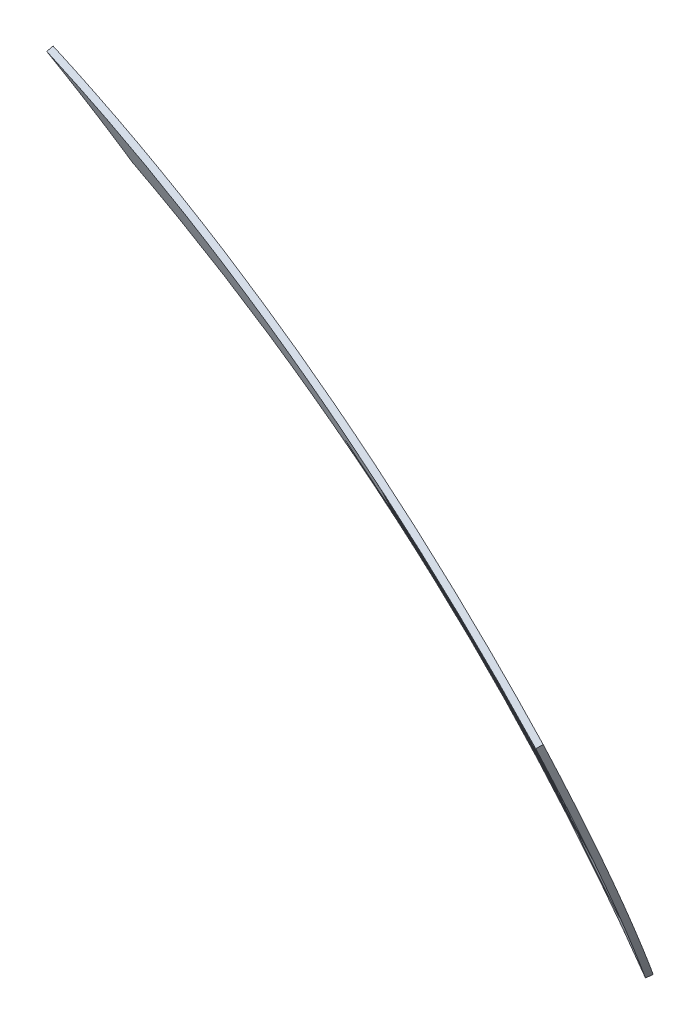
ISO-10303-21;
HEADER;
FILE_DESCRIPTION(('STEP AP214'),'2;1');
FILE_NAME('part.step','',(''),(''),'','','');
FILE_SCHEMA(('AUTOMOTIVE_DESIGN { 1 0 10303 214 1 1 1 1 }'));
ENDSEC;
DATA;
#1=APPLICATION_CONTEXT('core data for automotive mechanical design processes');
#2=APPLICATION_PROTOCOL_DEFINITION('international standard','automotive_design',2000,#1);
#3=PRODUCT_CONTEXT('',#1,'mechanical');
#4=PRODUCT('Part','Part','',(#3));
#5=PRODUCT_RELATED_PRODUCT_CATEGORY('part','',(#4));
#6=PRODUCT_DEFINITION_FORMATION('','',#4);
#7=PRODUCT_DEFINITION_CONTEXT('part definition',#1,'design');
#8=PRODUCT_DEFINITION('design','',#6,#7);
#9=PRODUCT_DEFINITION_SHAPE('','',#8);
#10=(LENGTH_UNIT() NAMED_UNIT(*) SI_UNIT(.MILLI.,.METRE.));
#11=(NAMED_UNIT(*) PLANE_ANGLE_UNIT() SI_UNIT($,.RADIAN.));
#12=(NAMED_UNIT(*) SI_UNIT($,.STERADIAN.) SOLID_ANGLE_UNIT());
#13=UNCERTAINTY_MEASURE_WITH_UNIT(LENGTH_MEASURE(1.E-05),#10,'distance_accuracy_value','');
#14=(GEOMETRIC_REPRESENTATION_CONTEXT(3) GLOBAL_UNCERTAINTY_ASSIGNED_CONTEXT((#13)) GLOBAL_UNIT_ASSIGNED_CONTEXT((#10,
#11,#12)) REPRESENTATION_CONTEXT('',''));
#15=CARTESIAN_POINT('',(0.,0.,0.));
#16=DIRECTION('',(0.,0.,1.));
#17=DIRECTION('',(1.,0.,0.));
#18=AXIS2_PLACEMENT_3D('',#15,#16,#17);
#19=CARTESIAN_POINT('',(117.098250541684,-182.228188433962,-2.70380006520956));
#20=DIRECTION('',(0.,0.,1.));
#21=DIRECTION('',(1.,0.,0.));
#22=AXIS2_PLACEMENT_3D('',#19,#20,#21);
#23=CONICAL_SURFACE('',#22,60.5897364806195,0.959931088596881);
#24=CARTESIAN_POINT('',(161.492760793445,-141.105604775318,-2.75685890943699));
#25=CARTESIAN_POINT('',(161.377600861442,-141.041369525123,-2.78545030596426));
#26=CARTESIAN_POINT('',(161.262215504579,-140.977554668999,-2.81408465079402));
#27=CARTESIAN_POINT('',(160.684135657812,-140.660563561595,-2.95747728403579));
#28=CARTESIAN_POINT('',(160.218111338077,-140.413709392308,-3.07286617355404));
#29=CARTESIAN_POINT('',(159.279405307382,-139.933615500524,-3.30487172832728));
#30=CARTESIAN_POINT('',(158.806723603757,-139.700375763033,-3.42148839222981));
#31=CARTESIAN_POINT('',(158.093048192433,-139.360844759482,-3.59725987012974));
#32=CARTESIAN_POINT('',(157.854389869038,-139.249393142353,-3.65598924465637));
#33=CARTESIAN_POINT('',(157.136090258909,-138.920196544889,-3.83260475539952));
#34=CARTESIAN_POINT('',(156.654159132983,-138.707626989445,-3.95090969366212));
#35=CARTESIAN_POINT('',(155.927060021143,-138.399283279615,-4.12914039461711));
#36=CARTESIAN_POINT('',(155.684002274751,-138.298257340373,-4.18867730382686));
#37=CARTESIAN_POINT('',(154.952720151322,-138.00043551201,-4.36768650838482));
#38=CARTESIAN_POINT('',(154.462422537002,-137.808911335904,-4.48754853148067));
#39=CARTESIAN_POINT('',(153.723207440795,-137.532344136451,-4.6680739213172));
#40=CARTESIAN_POINT('',(153.476183475011,-137.441944716713,-4.72836887352205));
#41=CARTESIAN_POINT('',(152.733221475933,-137.176127004514,-4.90964198137573));
#42=CARTESIAN_POINT('',(152.235430010954,-137.006103586838,-5.03099942670794));
#43=CARTESIAN_POINT('',(151.235364904017,-136.680542449408,-5.2746200241178));
#44=CARTESIAN_POINT('',(150.733091267206,-136.525004713019,-5.39688317515513));
#45=CARTESIAN_POINT('',(149.724468997273,-136.228425724524,-5.64218653121705));
#46=CARTESIAN_POINT('',(149.218120368647,-136.087384456422,-5.76522673538409));
#47=CARTESIAN_POINT('',(148.201758178106,-135.819850554539,-6.01197904042362));
#48=CARTESIAN_POINT('',(147.691744618779,-135.693357910483,-6.13569114082155));
#49=CARTESIAN_POINT('',(146.668454761974,-135.454983507083,-6.38369441659202));
#50=CARTESIAN_POINT('',(146.15517846555,-135.343101743022,-6.50798559177762));
#51=CARTESIAN_POINT('',(145.125762226245,-135.134030529795,-6.75707034618939));
#52=CARTESIAN_POINT('',(144.60962228322,-135.036841081367,-6.88186392544078));
#53=CARTESIAN_POINT('',(143.574884913592,-134.8572511979,-7.13188761943008));
#54=CARTESIAN_POINT('',(143.056287485968,-134.774850769014,-7.25711773434961));
#55=CARTESIAN_POINT('',(141.689481768354,-134.577716410977,-7.58703762813863));
#56=CARTESIAN_POINT('',(140.839556417405,-134.475340607609,-7.79205740996994));
#57=CARTESIAN_POINT('',(139.987714685871,-134.393033365888,-7.99752302693633));
#58=B_SPLINE_CURVE_WITH_KNOTS('',3,(#24,#25,#26,#27,#28,#29,#30,#31,#32,#33,#34,#35,#36,#37,#38,
#39,#40,#41,#42,#43,#44,#45,#46,#47,#48,#49,#50,#51,#52,#53,#54,#55,#56,#57),.UNSPECIFIED.,.F.,
.F.,(4,2,2,2,2,2,2,2,2,2,2,2,2,2,2,2,4),(0.,0.404785661386019,2.02408006069358,3.64337267644333,
4.45295880883794,6.07225026958366,6.88183637561526,8.50112834331741,9.31071462071947,
10.9300082648246,12.5493000492474,14.1685900469492,15.7878789011031,17.4071672325898,
19.0264556454171,20.6457447320423,23.2857180388),.UNSPECIFIED.);
#59=CARTESIAN_POINT('',(161.492760793445,-141.105604775318,-2.75685890943716));
#60=VERTEX_POINT('',#59);
#61=CARTESIAN_POINT('',(139.987714685871,-134.393033365888,-7.99752302693652));
#62=VERTEX_POINT('',#61);
#63=EDGE_CURVE('E24',#60,#62,#58,.T.);
#64=ORIENTED_EDGE('',*,*,#63,.T.);
#65=CARTESIAN_POINT('',(139.987714685871,-134.393033365888,-7.9975230269364));
#66=CARTESIAN_POINT('',(139.992346437865,-134.507453607071,-8.06839270908273));
#67=CARTESIAN_POINT('',(139.995634027458,-134.621768217353,-8.13954595753076));
#68=CARTESIAN_POINT('',(140.005447377594,-135.193017379033,-8.49686090490755));
#69=CARTESIAN_POINT('',(139.992050777032,-135.647968683931,-8.78704423252712));
#70=CARTESIAN_POINT('',(139.938920781542,-136.363793370773,-9.25266430869019));
#71=CARTESIAN_POINT('',(139.912361220447,-136.627163499629,-9.42595602925661));
#72=CARTESIAN_POINT('',(139.864879909324,-137.000483347974,-9.67445744911157));
#73=CARTESIAN_POINT('',(139.849477652852,-137.111693123481,-9.74885104371585));
#74=CARTESIAN_POINT('',(139.775606784382,-137.6048661332,-10.0804026850163));
#75=CARTESIAN_POINT('',(139.703951361706,-137.983707438189,-10.3394946224094));
#76=CARTESIAN_POINT('',(139.593406296772,-138.466748636163,-10.675742497114));
#77=CARTESIAN_POINT('',(139.567361819456,-138.575018232815,-10.7514987942417));
#78=CARTESIAN_POINT('',(139.448216995419,-139.047155468817,-11.0835807574499));
#79=CARTESIAN_POINT('',(139.34284709799,-139.406990407948,-11.3411894895938));
#80=CARTESIAN_POINT('',(139.22408046999,-139.761883533146,-11.59999961285));
#81=B_SPLINE_CURVE_WITH_KNOTS('',3,(#65,#66,#67,#68,#69,#70,#71,#72,#73,#74,#75,#76,#77,#78,#79,
#80),.UNSPECIFIED.,.F.,.F.,(4,2,2,2,2,2,2,4),(0.,0.404039967203251,2.02138933714254,
2.97026784667473,3.37430460638591,4.76665393130027,5.17069019074777,6.53488990231756),.UNSPECIFIED.);
#82=CARTESIAN_POINT('',(139.224080469256,-139.761883535336,-11.5999996144475));
#83=VERTEX_POINT('',#82);
#84=EDGE_CURVE('E119',#62,#83,#81,.T.);
#85=ORIENTED_EDGE('',*,*,#84,.T.);
#86=CARTESIAN_POINT('',(139.224080467896,-139.7618835372,-11.5999996160451));
#87=CARTESIAN_POINT('',(139.344947760701,-139.824857801608,-11.5999996494662));
#88=CARTESIAN_POINT('',(139.465544888548,-139.88835577574,-11.6000047399864));
#89=CARTESIAN_POINT('',(140.067223674181,-140.208483281274,-11.600053076127));
#90=CARTESIAN_POINT('',(140.544182287969,-140.472920958143,-11.6001649766075));
#91=CARTESIAN_POINT('',(141.488711247322,-141.018027697156,-11.6004735845137));
#92=CARTESIAN_POINT('',(141.956281605265,-141.2986967379,-11.6006702918275));
#93=CARTESIAN_POINT('',(142.881541559487,-141.87588163013,-11.6010958966157));
#94=CARTESIAN_POINT('',(143.339231166741,-142.172397464013,-11.6013247940543));
#95=CARTESIAN_POINT('',(144.244219888096,-142.780872131446,-11.6017712994758));
#96=CARTESIAN_POINT('',(144.691519011491,-143.092830951183,-11.6019889074687));
#97=CARTESIAN_POINT('',(145.575250011105,-143.731801972814,-11.6023789968132));
#98=CARTESIAN_POINT('',(146.011681894622,-144.0588141646,-11.6025514781951));
#99=CARTESIAN_POINT('',(146.657753027608,-144.560268911033,-11.6027589088288));
#100=CARTESIAN_POINT('',(146.871669234039,-144.729233759376,-11.6028195019011));
#101=CARTESIAN_POINT('',(147.509129702065,-145.241589956877,-11.6029726866688));
#102=CARTESIAN_POINT('',(147.928338637734,-145.590407609549,-11.6030366646342));
#103=CARTESIAN_POINT('',(148.754663774215,-146.302056405373,-11.6030799623009));
#104=CARTESIAN_POINT('',(149.161779976216,-146.664887547148,-11.6030592820106));
#105=CARTESIAN_POINT('',(149.963475391751,-147.404172265157,-11.6029358242955));
#106=CARTESIAN_POINT('',(150.358054603613,-147.780625843209,-11.6028330468598));
#107=CARTESIAN_POINT('',(150.940110287556,-148.355148078325,-11.6026274061342));
#108=CARTESIAN_POINT('',(151.132483195512,-148.548285098047,-11.6025502856887));
#109=CARTESIAN_POINT('',(151.704689893005,-149.132617876456,-11.6022970817994));
#110=CARTESIAN_POINT('',(152.079568753491,-149.528694423589,-11.602099167825));
#111=CARTESIAN_POINT('',(152.815599934039,-150.333380280787,-11.6016733387506));
#112=CARTESIAN_POINT('',(153.176752244414,-150.741989599694,-11.6014454236293));
#113=CARTESIAN_POINT('',(153.884891299269,-151.571326661273,-11.6009981951404));
#114=CARTESIAN_POINT('',(154.231878030607,-151.992054415186,-11.6007788817808));
#115=CARTESIAN_POINT('',(154.741340951573,-152.631836181991,-11.6004924206063));
#116=CARTESIAN_POINT('',(154.909316824279,-152.846533121215,-11.6004040220395));
#117=CARTESIAN_POINT('',(155.495770078477,-153.609525993118,-11.600129637712));
#118=CARTESIAN_POINT('',(155.904216153062,-154.165541363801,-11.6000013307997));
#119=CARTESIAN_POINT('',(156.300383800188,-154.730331253975,-11.5999996160447));
#120=B_SPLINE_CURVE_WITH_KNOTS('',3,(#86,#87,#88,#89,#90,#91,#92,#93,#94,#95,#96,#97,#98,#99,
#100,#101,#102,#103,#104,#105,#106,#107,#108,#109,#110,#111,#112,#113,#114,#115,#116,#117,#118,
#119),.UNSPECIFIED.,.F.,.F.,(4,2,2,2,2,2,2,2,2,2,2,2,2,2,2,2,4),(0.,0.408872020839658,
2.04458807111853,3.68030196468647,5.31601404127567,6.95172465489469,8.58743417009736,
9.4052000736828,11.0409086401911,12.6766170459614,14.3123256698991,15.1300915997847,
16.7658012577774,18.4015120700136,20.0372243996629,20.8549909253814,22.9242005441204),.UNSPECIFIED.);
#121=CARTESIAN_POINT('',(156.30038381715,-154.730331259621,-11.5999996085915));
#122=VERTEX_POINT('',#121);
#123=EDGE_CURVE('E69',#83,#122,#120,.T.);
#124=ORIENTED_EDGE('',*,*,#123,.T.);
#125=CARTESIAN_POINT('',(156.300383834113,-154.730331265267,-11.5999996011382));
#126=CARTESIAN_POINT('',(156.360717388649,-154.634618083669,-11.5269277900917));
#127=CARTESIAN_POINT('',(156.420649206034,-154.538599457658,-11.4539216388806));
#128=CARTESIAN_POINT('',(156.599219556168,-154.249607641827,-11.2350974651333));
#129=CARTESIAN_POINT('',(156.716623421017,-154.055713386669,-11.089485172184));
#130=CARTESIAN_POINT('',(156.890151212327,-153.762998268343,-10.8715029269887));
#131=CARTESIAN_POINT('',(156.947568034499,-153.665107418741,-10.7989098580556));
#132=CARTESIAN_POINT('',(157.061527172322,-153.468703494466,-10.6538743896247));
#133=CARTESIAN_POINT('',(157.118069471707,-153.370190408266,-10.5814319929513));
#134=CARTESIAN_POINT('',(157.286612248658,-153.073221799255,-10.3639916301319));
#135=CARTESIAN_POINT('',(157.397246627616,-152.873812053051,-10.2192344472534));
#136=CARTESIAN_POINT('',(157.614956598615,-152.472605565082,-9.93034406725243));
#137=CARTESIAN_POINT('',(157.722032081563,-152.270808750401,-9.78621088937537));
#138=CARTESIAN_POINT('',(157.932900083546,-151.865091233722,-9.49849003387055));
#139=CARTESIAN_POINT('',(158.036692322864,-151.66117035272,-9.35490240363287));
#140=CARTESIAN_POINT('',(158.240715143367,-151.251114739156,-9.06835985934827));
#141=CARTESIAN_POINT('',(158.340945747245,-151.044980020711,-8.9254049412752));
#142=CARTESIAN_POINT('',(158.537646866962,-150.630455521283,-8.64018601346895));
#143=CARTESIAN_POINT('',(158.634117456098,-150.422065784362,-8.49792199031491));
#144=CARTESIAN_POINT('',(158.823175245655,-150.003043079898,-8.21412154915863));
#145=CARTESIAN_POINT('',(158.915762414098,-149.792410093901,-8.0725851371565));
#146=CARTESIAN_POINT('',(159.187649968934,-149.157315332211,-7.64910988652479));
#147=CARTESIAN_POINT('',(159.36110537292,-148.729596724417,-7.36826305908693));
#148=CARTESIAN_POINT('',(159.609438209187,-148.082679869146,-6.94955484702435));
#149=CARTESIAN_POINT('',(159.690150654912,-147.866414802016,-6.81057832037151));
#150=CARTESIAN_POINT('',(159.84768883301,-147.432030225268,-6.53337915655913));
#151=CARTESIAN_POINT('',(159.924515008472,-147.213910930385,-6.39515643506571));
#152=CARTESIAN_POINT('',(160.149155665516,-146.556829502939,-5.9815956419051));
#153=CARTESIAN_POINT('',(160.291128420186,-146.115153879194,-5.70737144350254));
#154=CARTESIAN_POINT('',(160.559187411822,-145.225112710456,-5.16201946924881));
#155=CARTESIAN_POINT('',(160.685273612122,-144.776747150025,-4.89089170054577));
#156=CARTESIAN_POINT('',(160.862121862359,-144.099579713647,-4.48668225522962));
#157=CARTESIAN_POINT('',(160.919021922285,-143.873098721763,-4.35236606842541));
#158=CARTESIAN_POINT('',(161.074756640484,-143.227576247511,-3.97199679588965));
#159=CARTESIAN_POINT('',(161.168627070976,-142.806731180539,-3.7269444347703));
#160=CARTESIAN_POINT('',(161.341802934554,-141.959862958374,-3.23966266754507));
#161=CARTESIAN_POINT('',(161.421093780994,-141.533835067178,-2.99743631323277));
#162=CARTESIAN_POINT('',(161.492760793445,-141.105604775319,-2.75685890943739));
#163=B_SPLINE_CURVE_WITH_KNOTS('',3,(#125,#126,#127,#128,#129,#130,#131,#132,#133,#134,#135,
#136,#137,#138,#139,#140,#141,#142,#143,#144,#145,#146,#147,#148,#149,#150,#151,#152,#153,#154,
#155,#156,#157,#158,#159,#160,#161,#162),.UNSPECIFIED.,.F.,.F.,(4,2,2,2,2,2,2,2,2,2,2,2,2,2,2,2,
2,2,4),(0.,0.404064075643957,1.21225541906351,1.61640715466983,2.02056639924777,
2.83085311424808,3.64116464446178,4.45154502443383,5.26192024025546,6.07227965079434,
6.88264573312846,8.50313941533431,9.31144126118628,10.1196507405679,11.7361074132967,
13.352567816879,14.1607179374432,15.6483252788983,17.1374129448544),.UNSPECIFIED.);
#164=EDGE_CURVE('E66',#122,#60,#163,.T.);
#165=ORIENTED_EDGE('',*,*,#164,.T.);
#166=EDGE_LOOP('',(#64,#85,#124,#165));
#167=FACE_BOUND('',#166,.T.);
#168=ADVANCED_FACE('F17',(#167),#23,.F.);
#169=CARTESIAN_POINT('',(140.037725120438,-134.288519914743,-8.16299173988274));
#170=CARTESIAN_POINT('',(140.037560069499,-134.288864843625,-8.16244563851988));
#171=CARTESIAN_POINT('',(140.03739501856,-134.289209772506,-8.16189953715702));
#172=CARTESIAN_POINT('',(140.037229967621,-134.289554701388,-8.16135343579416));
#173=CARTESIAN_POINT('',(140.020724873704,-134.324047589555,-8.10674329950823));
#174=CARTESIAN_POINT('',(140.004219779788,-134.358540477721,-8.0521331632223));
#175=CARTESIAN_POINT('',(139.987714685871,-134.393033365888,-7.99752302693636));
#176=CARTESIAN_POINT('',(144.336835881695,-134.706883896802,-7.1278973751028));
#177=CARTESIAN_POINT('',(144.336644470875,-134.707216217099,-7.12735127373994));
#178=CARTESIAN_POINT('',(144.336453060056,-134.707548537396,-7.12680517237708));
#179=CARTESIAN_POINT('',(144.336261649236,-134.707880857693,-7.12625907101422));
#180=CARTESIAN_POINT('',(144.317120567273,-134.741112887389,-7.07164893472829));
#181=CARTESIAN_POINT('',(144.297985033979,-134.774346130122,-7.01703879844236));
#182=CARTESIAN_POINT('',(144.278843952016,-134.807578159818,-6.96242866215642));
#183=CARTESIAN_POINT('',(151.842228202437,-136.343004028003,-5.31572267476623));
#184=CARTESIAN_POINT('',(151.841994759805,-136.34330970977,-5.31517657340337));
#185=CARTESIAN_POINT('',(151.841761317174,-136.343615391537,-5.31463047204051));
#186=CARTESIAN_POINT('',(151.841527874542,-136.343921073304,-5.31408437067765));
#187=CARTESIAN_POINT('',(151.818183611383,-136.374489249997,-5.25947423439172));
#188=CARTESIAN_POINT('',(151.794837199186,-136.405056706666,-5.20486409810578));
#189=CARTESIAN_POINT('',(151.771492936028,-136.435624883359,-5.15025396181985));
#190=CARTESIAN_POINT('',(158.778840714917,-139.463587192947,-3.61624611019749));
#191=CARTESIAN_POINT('',(158.778573253153,-139.463861149866,-3.61570000883463));
#192=CARTESIAN_POINT('',(158.778305791388,-139.464135106785,-3.61515390747177));
#193=CARTESIAN_POINT('',(158.778038329623,-139.464409063704,-3.61460780610891));
#194=CARTESIAN_POINT('',(158.751292153148,-139.491804755598,-3.55999766982297));
#195=CARTESIAN_POINT('',(158.72454671768,-139.519200791778,-3.50538753353703));
#196=CARTESIAN_POINT('',(158.697800541205,-139.546596483672,-3.4507773972511));
#197=CARTESIAN_POINT('',(161.577760291674,-141.026869838114,-2.92232762238329));
#198=CARTESIAN_POINT('',(161.577479765278,-141.027129689392,-2.92178152102043));
#199=CARTESIAN_POINT('',(161.577199238881,-141.02738954067,-2.92123541965757));
#200=CARTESIAN_POINT('',(161.576918712484,-141.027649391948,-2.92068931829471));
#201=CARTESIAN_POINT('',(161.548866072804,-141.053634519738,-2.86607918200877));
#202=CARTESIAN_POINT('',(161.520813433125,-141.079619647528,-2.81146904572284));
#203=CARTESIAN_POINT('',(161.492760793445,-141.105604775318,-2.7568589094369));
#204=B_SPLINE_SURFACE_WITH_KNOTS('',3,3,((#169,#170,#171,#172,#173,#174,#175),(#176,#177,#178,
#179,#180,#181,#182),(#183,#184,#185,#186,#187,#188,#189),(#190,#191,#192,#193,#194,#195,#196),
(#197,#198,#199,#200,#201,#202,#203)),.UNSPECIFIED.,.F.,.F.,.F.,(4,1,4),(4,3,4),(0.,
0.571428571428571,1.),(-0.01,0.,1.),.UNSPECIFIED.);
#205=DIRECTION('',(-0.247576408753892,-0.517393322502868,0.819152044286022));
#206=VECTOR('',#205,1.);
#207=CARTESIAN_POINT('',(140.012224750337,-134.341811426961,-8.078619079321));
#208=LINE('',#207,#206);
#209=CARTESIAN_POINT('',(140.036082207705,-134.291954710098,-8.15755361789318));
#210=VERTEX_POINT('',#209);
#211=EDGE_CURVE('E78',#210,#62,#208,.T.);
#212=DIRECTION('',(0.420789595200184,0.389776916850634,-0.819152044288287));
#213=VECTOR('',#212,1.);
#214=CARTESIAN_POINT('',(161.534839752965,-141.066627083633,-2.83877411386609));
#215=LINE('',#214,#213);
#216=CARTESIAN_POINT('',(161.576918713948,-141.027649383147,-2.92068931335484));
#217=VERTEX_POINT('',#216);
#218=EDGE_CURVE('E73',#60,#217,#215,.T.);
#219=CARTESIAN_POINT('',(140.036082839782,-134.291954771446,-8.15755346593885));
#220=CARTESIAN_POINT('',(140.165399002504,-134.304505858785,-8.12646529861674));
#221=CARTESIAN_POINT('',(140.294674116229,-134.317519786354,-8.09538663857937));
#222=CARTESIAN_POINT('',(140.940873402443,-134.384903050024,-7.94003120946001));
#223=CARTESIAN_POINT('',(141.457128892226,-134.446200026702,-7.81590166940044));
#224=CARTESIAN_POINT('',(142.487762000089,-134.583433619411,-7.56799599012097));
#225=CARTESIAN_POINT('',(143.002139620063,-134.659370220679,-7.44421985054486));
#226=CARTESIAN_POINT('',(144.028642581487,-134.825768090976,-7.1970579634153));
#227=CARTESIAN_POINT('',(144.540767924434,-134.916229350356,-7.07367221560255));
#228=CARTESIAN_POINT('',(145.562347202999,-135.111568283438,-6.82735462414232));
#229=CARTESIAN_POINT('',(146.071801139469,-135.216445952547,-6.70442278035018));
#230=CARTESIAN_POINT('',(147.596011928378,-135.552671260794,-6.3363013644184));
#231=CARTESIAN_POINT('',(148.606326503804,-135.805563964007,-6.09185600263552));
#232=CARTESIAN_POINT('',(150.109962040859,-136.227458917993,-5.72736610626062));
#233=CARTESIAN_POINT('',(150.609131556598,-136.37515937436,-5.60624943710179));
#234=CARTESIAN_POINT('',(151.603284979129,-136.684742969512,-5.36481771066811));
#235=CARTESIAN_POINT('',(152.09826888115,-136.846626124455,-5.24450265430665));
#236=CARTESIAN_POINT('',(152.837225641719,-137.100051998554,-5.06474596266788));
#237=CARTESIAN_POINT('',(153.082949251079,-137.18629084671,-5.00494852385736));
#238=CARTESIAN_POINT('',(153.818367671251,-137.450301482986,-4.82590052058894));
#239=CARTESIAN_POINT('',(154.3062741833,-137.633355623566,-4.70700299151006));
#240=CARTESIAN_POINT('',(155.034180121924,-137.918312217908,-4.52940182448671));
#241=CARTESIAN_POINT('',(155.276147727846,-138.015023270972,-4.47032775990955));
#242=CARTESIAN_POINT('',(156.483038310844,-138.507353881407,-4.17547323208505));
#243=CARTESIAN_POINT('',(157.438067725035,-138.92889366399,-3.94149650622699));
#244=CARTESIAN_POINT('',(158.921918938169,-139.634742362834,-3.57668887779795));
#245=CARTESIAN_POINT('',(159.459057061152,-139.901050535649,-3.44436243022437));
#246=CARTESIAN_POINT('',(160.524631763164,-140.451219150354,-3.18130312708213));
#247=CARTESIAN_POINT('',(161.053068733326,-140.735078800528,-3.05057019995058));
#248=CARTESIAN_POINT('',(161.576918664152,-141.027649364953,-2.92068933027752));
#249=B_SPLINE_CURVE_WITH_KNOTS('',3,(#219,#220,#221,#222,#223,#224,#225,#226,#227,#228,#229,
#230,#231,#232,#233,#234,#235,#236,#237,#238,#239,#240,#241,#242,#243,#244,#245,#246,#247,#248),
.UNSPECIFIED.,.F.,.F.,(4,2,2,2,2,2,2,2,2,2,2,2,2,2,4),(0.,0.400777782407553,2.00403333468296,
3.60728727034696,5.21054014090244,6.81379250044819,10.021205885466,11.6244601339171,
13.2277162088836,14.0292864519198,15.6325431710684,16.4341131804315,19.6415487718076,
21.4831699718292,23.3247081600789),.UNSPECIFIED.);
#250=EDGE_CURVE('E113',#210,#217,#249,.T.);
#251=ORIENTED_EDGE('',*,*,#211,.T.);
#252=ORIENTED_EDGE('',*,*,#63,.F.);
#253=ORIENTED_EDGE('',*,*,#218,.T.);
#254=ORIENTED_EDGE('',*,*,#250,.F.);
#255=EDGE_LOOP('',(#251,#252,#253,#254));
#256=FACE_BOUND('',#255,.T.);
#257=ADVANCED_FACE('F75',(#256),#204,.F.);
#258=CARTESIAN_POINT('',(161.577760291674,-141.026869838114,-2.92232762238348));
#259=CARTESIAN_POINT('',(161.577479765278,-141.027129689392,-2.92178152102062));
#260=CARTESIAN_POINT('',(161.577199238881,-141.02738954067,-2.92123541965776));
#261=CARTESIAN_POINT('',(161.576918712484,-141.027649391948,-2.9206893182949));
#262=CARTESIAN_POINT('',(161.548866072804,-141.053634519738,-2.86607918200903));
#263=CARTESIAN_POINT('',(161.520813433125,-141.079619647529,-2.81146904572315));
#264=CARTESIAN_POINT('',(161.492760793445,-141.105604775319,-2.75685890943727));
#265=CARTESIAN_POINT('',(161.492477461784,-141.10586722511,-2.75630734706078));
#266=CARTESIAN_POINT('',(161.492194130123,-141.1061296749,-2.7557557846843));
#267=CARTESIAN_POINT('',(161.491910798463,-141.106392124691,-2.75520422230781));
#268=CARTESIAN_POINT('',(161.092659411959,-143.942865610318,-4.55903629348516));
#269=CARTESIAN_POINT('',(161.092371121378,-143.94311708768,-4.5584901921223));
#270=CARTESIAN_POINT('',(161.092082830796,-143.943368565042,-4.55794409075944));
#271=CARTESIAN_POINT('',(161.091794540215,-143.943620042404,-4.55739798939658));
#272=CARTESIAN_POINT('',(161.06296548208,-143.968767778611,-4.5027878531107));
#273=CARTESIAN_POINT('',(161.034138978357,-143.993915864187,-4.44817771682481));
#274=CARTESIAN_POINT('',(161.005309920222,-144.019063600394,-4.39356758053893));
#275=CARTESIAN_POINT('',(161.005018746735,-144.01931759253,-4.39301601816244));
#276=CARTESIAN_POINT('',(161.004727573248,-144.019571584665,-4.39246445578596));
#277=CARTESIAN_POINT('',(161.004436399761,-144.019825576801,-4.39191289340947));
#278=CARTESIAN_POINT('',(159.941729618257,-147.786609536982,-6.90069854071219));
#279=CARTESIAN_POINT('',(159.941431839086,-147.786849696774,-6.90015243934933));
#280=CARTESIAN_POINT('',(159.941134059916,-147.787089856567,-6.89960633798647));
#281=CARTESIAN_POINT('',(159.940836280746,-147.78733001636,-6.89906023662361));
#282=CARTESIAN_POINT('',(159.911058363726,-147.811345995643,-6.84445010033771));
#283=CARTESIAN_POINT('',(159.881281407528,-147.835363130959,-6.78983996405182));
#284=CARTESIAN_POINT('',(159.851503490508,-147.859379110241,-6.73522982776591));
#285=CARTESIAN_POINT('',(159.851202733546,-147.859621671632,-6.73467826538942));
#286=CARTESIAN_POINT('',(159.850901976584,-147.859864233023,-6.73412670301293));
#287=CARTESIAN_POINT('',(159.850601219622,-147.860106794413,-6.73357514063645));
#288=CARTESIAN_POINT('',(158.260973047857,-151.369714592052,-9.35522750489933));
#289=CARTESIAN_POINT('',(158.260667130047,-151.369944040295,-9.35468140353647));
#290=CARTESIAN_POINT('',(158.260361212237,-151.370173488538,-9.35413530217361));
#291=CARTESIAN_POINT('',(158.260055294427,-151.370402936781,-9.35358920081075));
#292=CARTESIAN_POINT('',(158.229463513416,-151.393347761073,-9.29897906452484));
#293=CARTESIAN_POINT('',(158.198869844492,-151.416290368967,-9.24436892823893));
#294=CARTESIAN_POINT('',(158.168278063481,-151.439235193259,-9.18975879195301));
#295=CARTESIAN_POINT('',(158.167969086493,-151.439466935984,-9.18920722957652));
#296=CARTESIAN_POINT('',(158.167660109505,-151.43969867871,-9.18865566720003));
#297=CARTESIAN_POINT('',(158.167351132516,-151.439930421435,-9.18810410482355));
#298=CARTESIAN_POINT('',(157.290986138615,-153.186780120047,-10.655809450263));
#299=CARTESIAN_POINT('',(157.290676209946,-153.187004112095,-10.6552633489001));
#300=CARTESIAN_POINT('',(157.290366281278,-153.187228104142,-10.6547172475373));
#301=CARTESIAN_POINT('',(157.290056352609,-153.18745209619,-10.6541711461744));
#302=CARTESIAN_POINT('',(157.259063485742,-153.209851300956,-10.5995610098885));
#303=CARTESIAN_POINT('',(157.228072824038,-153.232252838514,-10.5449508736026));
#304=CARTESIAN_POINT('',(157.197079957171,-153.254652043281,-10.4903407373167));
#305=CARTESIAN_POINT('',(157.196766929216,-153.254878275249,-10.4897891749402));
#306=CARTESIAN_POINT('',(157.19645390126,-153.255104507217,-10.4892376125637));
#307=CARTESIAN_POINT('',(157.196140873305,-153.255330739185,-10.4886860501872));
#308=CARTESIAN_POINT('',(156.765060401504,-154.075984569588,-11.3171126533402));
#309=CARTESIAN_POINT('',(156.764748592703,-154.076205920607,-11.3165665519773));
#310=CARTESIAN_POINT('',(156.764436783902,-154.076427271627,-11.3160204506145));
#311=CARTESIAN_POINT('',(156.764124975101,-154.076648622646,-11.3154743492516));
#312=CARTESIAN_POINT('',(156.732944095002,-154.098783724576,-11.2608642129657));
#313=CARTESIAN_POINT('',(156.701759888583,-154.120915042668,-11.2062540766797));
#314=CARTESIAN_POINT('',(156.670579008484,-154.143050144598,-11.1516439403938));
#315=CARTESIAN_POINT('',(156.670264081595,-154.143273709127,-11.1510923780173));
#316=CARTESIAN_POINT('',(156.669949154706,-154.143497273657,-11.1505408156408));
#317=CARTESIAN_POINT('',(156.669634227817,-154.143720838187,-11.1499892532643));
#318=CARTESIAN_POINT('',(156.395237932777,-154.663797013705,-11.7654683091632));
#319=CARTESIAN_POINT('',(156.39492488296,-154.664016598672,-11.7649222078003));
#320=CARTESIAN_POINT('',(156.394611833143,-154.66423618364,-11.7643761064375));
#321=CARTESIAN_POINT('',(156.394298783326,-154.664455768607,-11.7638300050746));
#322=CARTESIAN_POINT('',(156.36299380161,-154.686414265345,-11.7092198687886));
#323=CARTESIAN_POINT('',(156.331688819893,-154.708372762083,-11.6546097325027));
#324=CARTESIAN_POINT('',(156.300383838176,-154.730331258821,-11.5999995962168));
#325=CARTESIAN_POINT('',(156.300067657861,-154.730553039638,-11.5994480338403));
#326=CARTESIAN_POINT('',(156.299751477545,-154.730774820455,-11.5988964714638));
#327=CARTESIAN_POINT('',(156.29943529723,-154.730996601272,-11.5983449090873));
#328=B_SPLINE_SURFACE_WITH_KNOTS('',3,3,((#258,#259,#260,#261,#262,#263,#264,#265,#266,#267),
(#268,#269,#270,#271,#272,#273,#274,#275,#276,#277),(#278,#279,#280,#281,#282,#283,#284,#285,
#286,#287),(#288,#289,#290,#291,#292,#293,#294,#295,#296,#297),(#298,#299,#300,#301,#302,#303,
#304,#305,#306,#307),(#308,#309,#310,#311,#312,#313,#314,#315,#316,#317),(#318,#319,#320,#321,
#322,#323,#324,#325,#326,#327)),.UNSPECIFIED.,.F.,.F.,.F.,(4,1,1,1,4),(4,3,3,4),(0.,
0.571428571428571,0.785714285714286,0.857142857142857,1.),(-0.01,0.,1.,1.0101),.UNSPECIFIED.);
#329=DIRECTION('',(0.469574725583173,0.329377451300512,-0.819152044292307));
#330=VECTOR('',#329,1.);
#331=CARTESIAN_POINT('',(156.348180210335,-154.696805016202,-11.6833783341708));
#332=LINE('',#331,#330);
#333=CARTESIAN_POINT('',(156.394014957691,-154.664654718826,-11.7633350556309));
#334=VERTEX_POINT('',#333);
#335=EDGE_CURVE('E84',#122,#334,#332,.T.);
#336=CARTESIAN_POINT('',(161.576918715412,-141.027649374346,-2.92068930841481));
#337=CARTESIAN_POINT('',(161.557772089297,-141.142731933916,-2.98528436389856));
#338=CARTESIAN_POINT('',(161.538073134155,-141.257657271574,-3.04999990387129));
#339=CARTESIAN_POINT('',(161.436835945435,-141.831542807788,-3.37420318404217));
#340=CARTESIAN_POINT('',(161.347101793639,-142.288087519564,-3.63546011048044));
#341=CARTESIAN_POINT('',(161.150670096753,-143.196743722893,-4.16211501268794));
#342=CARTESIAN_POINT('',(161.043928258335,-143.648840272589,-4.42752212262767));
#343=CARTESIAN_POINT('',(160.814256657001,-144.547003293982,-4.96160350405956));
#344=CARTESIAN_POINT('',(160.691325601908,-144.9930692812,-5.23027803479251));
#345=CARTESIAN_POINT('',(160.429756739084,-145.878667055774,-5.77069099248334));
#346=CARTESIAN_POINT('',(160.291119360474,-146.318199021278,-6.04242933555048));
#347=CARTESIAN_POINT('',(159.998462787945,-147.190210450594,-6.58884121137081));
#348=CARTESIAN_POINT('',(159.844445116886,-147.622690607709,-6.86351445112894));
#349=CARTESIAN_POINT('',(159.602215665998,-148.2650989019,-7.27730421909333));
#350=CARTESIAN_POINT('',(159.519725193492,-148.477897702475,-7.41534174580183));
#351=CARTESIAN_POINT('',(159.350946432384,-148.901545776988,-7.69215050368209));
#352=CARTESIAN_POINT('',(159.264657701105,-149.112394820204,-7.83092181870791));
#353=CARTESIAN_POINT('',(159.08827304605,-149.532025337904,-8.10918754331182));
#354=CARTESIAN_POINT('',(158.998176980753,-149.740806735176,-8.24868197959926));
#355=CARTESIAN_POINT('',(158.814178757672,-150.156197779609,-8.52838483333569));
#356=CARTESIAN_POINT('',(158.720276657929,-150.362807459829,-8.66859323986801));
#357=CARTESIAN_POINT('',(158.528761294294,-150.773826353844,-8.94969508677448));
#358=CARTESIAN_POINT('',(158.431148052222,-150.978235580568,-9.09058852311674));
#359=CARTESIAN_POINT('',(158.232366262407,-151.384863507173,-9.37301244787169));
#360=CARTESIAN_POINT('',(158.131197797166,-151.587082257742,-9.51454292143527));
#361=CARTESIAN_POINT('',(157.925591168475,-151.989453473846,-9.79816452813794));
#362=CARTESIAN_POINT('',(157.82115299848,-152.189605935241,-9.9402556623991));
#363=CARTESIAN_POINT('',(157.611571029032,-152.58277755528,-10.2214812303344));
#364=CARTESIAN_POINT('',(157.506509115524,-152.775850445473,-10.3606014922794));
#365=CARTESIAN_POINT('',(157.292975130188,-153.15965627039,-10.6394496082674));
#366=CARTESIAN_POINT('',(157.184503079444,-153.35038921957,-10.7791774585491));
#367=CARTESIAN_POINT('',(156.964189620562,-153.729720080692,-11.059333666392));
#368=CARTESIAN_POINT('',(156.85234509326,-153.918315779439,-11.1997625655512));
#369=CARTESIAN_POINT('',(156.625508855076,-154.293206906382,-11.4811560944042));
#370=CARTESIAN_POINT('',(156.510517094438,-154.479502298144,-11.6221207325373));
#371=CARTESIAN_POINT('',(156.394015114475,-154.664654682709,-11.7633349512189));
#372=B_SPLINE_CURVE_WITH_KNOTS('',3,(#336,#337,#338,#339,#340,#341,#342,#343,#344,#345,#346,
#347,#348,#349,#350,#351,#352,#353,#354,#355,#356,#357,#358,#359,#360,#361,#362,#363,#364,#365,
#366,#367,#368,#369,#370,#371),.UNSPECIFIED.,.F.,.F.,(4,2,2,2,2,2,2,2,2,2,2,2,2,2,2,2,2,4),(0.,
0.400064412496613,2.00054436805932,3.60526273140051,5.21010925647346,6.81491194518904,
8.41955589375361,9.21970311505139,10.0199438397703,10.820214335996,11.6204726325251,
12.4207262246561,13.220961258785,14.0211978952738,14.8015679136557,15.5819331079618,
16.36304363876,17.1441665256441),.UNSPECIFIED.);
#373=EDGE_CURVE('E81',#217,#334,#372,.T.);
#374=ORIENTED_EDGE('',*,*,#218,.F.);
#375=ORIENTED_EDGE('',*,*,#164,.F.);
#376=ORIENTED_EDGE('',*,*,#335,.T.);
#377=ORIENTED_EDGE('',*,*,#373,.F.);
#378=EDGE_LOOP('',(#374,#375,#376,#377));
#379=FACE_BOUND('',#378,.T.);
#380=ADVANCED_FACE('F79',(#379),#328,.F.);
#381=CARTESIAN_POINT('',(156.395976414545,-154.663278953007,-11.7667566683416));
#382=CARTESIAN_POINT('',(156.395417260111,-154.66367116505,-11.7657812485137));
#383=CARTESIAN_POINT('',(156.394858105676,-154.664063377093,-11.7648058286857));
#384=CARTESIAN_POINT('',(156.394298951242,-154.664455589136,-11.7638304088578));
#385=CARTESIAN_POINT('',(156.362993969536,-154.68641408589,-11.7092202725719));
#386=CARTESIAN_POINT('',(156.331688987831,-154.708372582644,-11.6546101362859));
#387=CARTESIAN_POINT('',(156.300384006126,-154.730331079398,-11.6));
#388=CARTESIAN_POINT('',(156.300065364765,-154.730554586486,-11.5994441444389));
#389=CARTESIAN_POINT('',(156.299746723403,-154.730778093574,-11.5988882888777));
#390=CARTESIAN_POINT('',(156.299428082042,-154.731001600662,-11.5983324333166));
#391=CARTESIAN_POINT('',(151.9967682553,-148.391577185024,-11.7667566683416));
#392=CARTESIAN_POINT('',(151.996271621515,-148.392058713333,-11.7657812485137));
#393=CARTESIAN_POINT('',(151.99577498773,-148.392540241642,-11.7648058286857));
#394=CARTESIAN_POINT('',(151.995278353945,-148.393021769951,-11.7638304088578));
#395=CARTESIAN_POINT('',(151.967473671374,-148.41998075297,-11.7092202725719));
#396=CARTESIAN_POINT('',(151.939681458384,-148.446926587406,-11.6546101362859));
#397=CARTESIAN_POINT('',(151.911876775813,-148.473885570424,-11.6));
#398=CARTESIAN_POINT('',(151.911593762649,-148.474159975537,-11.5994441444389));
#399=CARTESIAN_POINT('',(151.911310749486,-148.474434380651,-11.5988882888777));
#400=CARTESIAN_POINT('',(151.911027736322,-148.474708785764,-11.5983324333166));
#401=CARTESIAN_POINT('',(146.071949232527,-143.198102812847,-11.7667566683416));
#402=CARTESIAN_POINT('',(146.071536907402,-143.198658242969,-11.7657812485137));
#403=CARTESIAN_POINT('',(146.071124582278,-143.199213673091,-11.7648058286857));
#404=CARTESIAN_POINT('',(146.070712257153,-143.199769103213,-11.7638304088578));
#405=CARTESIAN_POINT('',(146.047627703606,-143.230865574488,-11.7092202725719));
#406=CARTESIAN_POINT('',(146.024554551956,-143.26194796129,-11.6546101362859));
#407=CARTESIAN_POINT('',(146.001469998409,-143.293044432565,-11.6));
#408=CARTESIAN_POINT('',(146.001235029622,-143.293360951579,-11.5994441444389));
#409=CARTESIAN_POINT('',(146.001000060836,-143.293677470593,-11.5988882888777));
#410=CARTESIAN_POINT('',(146.000765092049,-143.293993989607,-11.5983324333166));
#411=CARTESIAN_POINT('',(139.278033303239,-139.658331373807,-11.7667566683416));
#412=CARTESIAN_POINT('',(139.277717714395,-139.658937086321,-11.7657812485137));
#413=CARTESIAN_POINT('',(139.277402125551,-139.659542798835,-11.7648058286857));
#414=CARTESIAN_POINT('',(139.277086536707,-139.660148511349,-11.7638304088578));
#415=CARTESIAN_POINT('',(139.259417888512,-139.694060107157,-11.7092202725719));
#416=CARTESIAN_POINT('',(139.241749240316,-139.727971702965,-11.6546101362859));
#417=CARTESIAN_POINT('',(139.224080592121,-139.761883298773,-11.6));
#418=CARTESIAN_POINT('',(139.223900749751,-139.762228471856,-11.5994441444389));
#419=CARTESIAN_POINT('',(139.22372090738,-139.762573644939,-11.5988882888777));
#420=CARTESIAN_POINT('',(139.22354106501,-139.762918818023,-11.5983324333166));
#421=B_SPLINE_SURFACE_WITH_KNOTS('',3,3,((#381,#382,#383,#384,#385,#386,#387,#388,#389,#390),
(#391,#392,#393,#394,#395,#396,#397,#398,#399,#400),(#401,#402,#403,#404,#405,#406,#407,#408,
#409,#410),(#411,#412,#413,#414,#415,#416,#417,#418,#419,#420)),.UNSPECIFIED.,.F.,.F.,.F.,(4,4),
(4,3,3,4),(0.,1.),(-0.0178615160897731,0.,1.,1.0101786151609),.UNSPECIFIED.);
#422=DIRECTION('',(0.265029722926556,0.508673937107867,-0.819152044294986));
#423=VECTOR('',#422,1.);
#424=CARTESIAN_POINT('',(139.250318412527,-139.711524813468,-11.6810956653056));
#425=LINE('',#424,#423);
#426=CARTESIAN_POINT('',(139.2760663767,-139.662106534742,-11.7606773996102));
#427=VERTEX_POINT('',#426);
#428=EDGE_CURVE('E45',#83,#427,#425,.T.);
#429=CARTESIAN_POINT('',(156.394014922853,-154.664654669148,-11.7633350556399));
#430=CARTESIAN_POINT('',(156.315762707475,-154.553069494461,-11.7633558068636));
#431=CARTESIAN_POINT('',(156.237027431394,-154.441820166868,-11.7633809560978));
#432=CARTESIAN_POINT('',(155.840911146076,-153.887211804499,-11.763526308544));
#433=CARTESIAN_POINT('',(155.51634036298,-153.448954023443,-11.7637052995403));
#434=CARTESIAN_POINT('',(154.852358752803,-152.583851092382,-11.7641272290206));
#435=CARTESIAN_POINT('',(154.512947945157,-152.157005927431,-11.7643701674208));
#436=CARTESIAN_POINT('',(153.819730494339,-151.315164840008,-11.7648675373787));
#437=CARTESIAN_POINT('',(153.46592386706,-150.900168904455,-11.7651219689238));
#438=CARTESIAN_POINT('',(152.744380273965,-150.082477415529,-11.7655989597034));
#439=CARTESIAN_POINT('',(152.376643320541,-149.679781851213,-11.7658215189663));
#440=CARTESIAN_POINT('',(151.627686276549,-148.887111493719,-11.7662009936039));
#441=CARTESIAN_POINT('',(151.246466195,-148.497136692034,-11.7663579090224));
#442=CARTESIAN_POINT('',(150.664928726503,-147.922090244165,-11.7665266172832));
#443=CARTESIAN_POINT('',(150.469475861017,-147.732070743491,-11.7665717419198));
#444=CARTESIAN_POINT('',(149.878270086291,-147.166969051001,-11.7666708248363));
#445=CARTESIAN_POINT('',(149.477711076592,-146.796885687987,-11.7666884745783));
#446=CARTESIAN_POINT('',(148.664297454432,-146.07051524269,-11.7666185410434));
#447=CARTESIAN_POINT('',(148.251442843215,-145.714228159012,-11.7665309577772));
#448=CARTESIAN_POINT('',(147.413882455713,-145.015838253435,-11.7662530006));
#449=CARTESIAN_POINT('',(146.989176677908,-144.673735433355,-11.7660626266758));
#450=CARTESIAN_POINT('',(146.343653698029,-144.171576031489,-11.7657099629047));
#451=CARTESIAN_POINT('',(146.12708054689,-144.006030657146,-11.7655812332416));
#452=CARTESIAN_POINT('',(145.473128911235,-143.514897393395,-11.7651653301467));
#453=CARTESIAN_POINT('',(145.031564269439,-143.194849437596,-11.7648484640721));
#454=CARTESIAN_POINT('',(144.137815820682,-142.569970989752,-11.7641635520858));
#455=CARTESIAN_POINT('',(143.685632006339,-142.265140508285,-11.7637955061385));
#456=CARTESIAN_POINT('',(142.771111875469,-141.671076651042,-11.7630465624785));
#457=CARTESIAN_POINT('',(142.30877554965,-141.381843289542,-11.762665664754));
#458=CARTESIAN_POINT('',(141.608101846004,-140.960027369369,-11.7621205348348));
#459=CARTESIAN_POINT('',(141.373362093967,-140.821434991604,-11.7619432032771));
#460=CARTESIAN_POINT('',(140.524749346391,-140.330176502943,-11.7613338814413));
#461=CARTESIAN_POINT('',(139.90413747443,-139.989135524541,-11.7609475150588));
#462=CARTESIAN_POINT('',(139.276067417848,-139.662107012756,-11.7606773602364));
#463=B_SPLINE_CURVE_WITH_KNOTS('',3,(#429,#430,#431,#432,#433,#434,#435,#436,#437,#438,#439,
#440,#441,#442,#443,#444,#445,#446,#447,#448,#449,#450,#451,#452,#453,#454,#455,#456,#457,#458,
#459,#460,#461,#462),.UNSPECIFIED.,.F.,.F.,(4,2,2,2,2,2,2,2,2,2,2,2,2,2,2,2,4),(0.,
0.408872008474541,2.04458727499267,3.68030039937683,5.31601171809525,6.95172158172169,
8.58743035125687,9.40519616181806,11.0409039823296,12.6766116373047,14.3123195020141,
15.1300853358589,16.7657942153367,18.4015042319699,20.0372157457694,20.8549821672087,
22.9788418860428),.UNSPECIFIED.);
#464=EDGE_CURVE('E36',#334,#427,#463,.T.);
#465=ORIENTED_EDGE('',*,*,#335,.F.);
#466=ORIENTED_EDGE('',*,*,#123,.F.);
#467=ORIENTED_EDGE('',*,*,#428,.T.);
#468=ORIENTED_EDGE('',*,*,#464,.F.);
#469=EDGE_LOOP('',(#465,#466,#467,#468));
#470=FACE_BOUND('',#469,.T.);
#471=ADVANCED_FACE('F138',(#470),#421,.F.);
#472=CARTESIAN_POINT('',(139.260273634234,-139.710431590544,-11.8004941054634));
#473=CARTESIAN_POINT('',(139.242599116949,-139.744340135938,-11.7458839691774));
#474=CARTESIAN_POINT('',(139.224924565023,-139.778248640769,-11.6912738328915));
#475=CARTESIAN_POINT('',(139.207250047737,-139.812157186164,-11.6366636966056));
#476=CARTESIAN_POINT('',(139.207073302564,-139.812496271618,-11.6361175952428));
#477=CARTESIAN_POINT('',(139.206896557391,-139.812835357072,-11.6355714938799));
#478=CARTESIAN_POINT('',(139.206719812218,-139.813174442526,-11.635025392517));
#479=CARTESIAN_POINT('',(139.265877894337,-139.693670642303,-11.7882727442352));
#480=CARTESIAN_POINT('',(139.248205333415,-139.727580204501,-11.7336626079492));
#481=CARTESIAN_POINT('',(139.2305327494,-139.761489739657,-11.6790524716633));
#482=CARTESIAN_POINT('',(139.212860188477,-139.795399301857,-11.6244423353774));
#483=CARTESIAN_POINT('',(139.212683462868,-139.795738397479,-11.6238962340146));
#484=CARTESIAN_POINT('',(139.212506737259,-139.796077493101,-11.6233501326517));
#485=CARTESIAN_POINT('',(139.212330011649,-139.796416588723,-11.6228040312888));
#486=CARTESIAN_POINT('',(139.27148215444,-139.676909694061,-11.776051383007));
#487=CARTESIAN_POINT('',(139.253811549882,-139.710820273064,-11.721441246721));
#488=CARTESIAN_POINT('',(139.236140933776,-139.744730838546,-11.6668311104351));
#489=CARTESIAN_POINT('',(139.218470329217,-139.77864141755,-11.6122209741492));
#490=CARTESIAN_POINT('',(139.218293623171,-139.77898052334,-11.6116748727863));
#491=CARTESIAN_POINT('',(139.218116917126,-139.77931962913,-11.6111287714235));
#492=CARTESIAN_POINT('',(139.21794021108,-139.77965873492,-11.6105826700606));
#493=CARTESIAN_POINT('',(139.277086414543,-139.66014874582,-11.7638300217788));
#494=CARTESIAN_POINT('',(139.259417766348,-139.694060341627,-11.7092198854928));
#495=CARTESIAN_POINT('',(139.241749118153,-139.727971937435,-11.6546097492069));
#496=CARTESIAN_POINT('',(139.224080469957,-139.761883533243,-11.599999612921));
#497=CARTESIAN_POINT('',(139.223903783475,-139.762222649201,-11.5994535115581));
#498=CARTESIAN_POINT('',(139.223727096993,-139.762561765159,-11.5989074101953));
#499=CARTESIAN_POINT('',(139.223550410511,-139.762900881117,-11.5983613088324));
#500=CARTESIAN_POINT('',(139.83751242485,-137.984053921684,-10.5416938989581));
#501=CARTESIAN_POINT('',(139.820039412992,-138.018067197914,-10.4870837626722));
#502=CARTESIAN_POINT('',(139.802567555815,-138.052081826316,-10.4324736263863));
#503=CARTESIAN_POINT('',(139.785094543956,-138.086095102546,-10.3778634901003));
#504=CARTESIAN_POINT('',(139.784919813837,-138.086435235308,-10.3773173887374));
#505=CARTESIAN_POINT('',(139.784745083719,-138.086775368071,-10.3767712873746));
#506=CARTESIAN_POINT('',(139.7845703536,-138.087115500833,-10.3762251860117));
#507=CARTESIAN_POINT('',(140.114003042027,-136.144287273481,-9.30963726457908));
#508=CARTESIAN_POINT('',(140.096933267179,-136.178509769671,-9.25502712829315));
#509=CARTESIAN_POINT('',(140.079863877952,-136.212733014709,-9.20041699200722));
#510=CARTESIAN_POINT('',(140.062794103103,-136.246955510899,-9.14580685572128));
#511=CARTESIAN_POINT('',(140.062623405354,-136.247297735861,-9.14526075435842));
#512=CARTESIAN_POINT('',(140.062452707606,-136.247639960823,-9.14471465299556));
#513=CARTESIAN_POINT('',(140.062282009858,-136.247982185785,-9.1441685516327));
#514=CARTESIAN_POINT('',(140.037229967621,-134.289554701388,-8.16135343579418));
#515=CARTESIAN_POINT('',(140.020724873704,-134.324047589555,-8.10674329950825));
#516=CARTESIAN_POINT('',(140.004219779788,-134.358540477721,-8.05213316322232));
#517=CARTESIAN_POINT('',(139.987714685871,-134.393033365888,-7.99752302693639));
#518=CARTESIAN_POINT('',(139.987549634932,-134.39337829477,-7.99697692557353));
#519=CARTESIAN_POINT('',(139.987384583993,-134.393723223651,-7.99643082421067));
#520=CARTESIAN_POINT('',(139.987219533054,-134.394068152533,-7.99588472284781));
#521=B_SPLINE_SURFACE_WITH_KNOTS('',3,3,((#472,#473,#474,#475,#476,#477,#478),(#479,#480,#481,
#482,#483,#484,#485),(#486,#487,#488,#489,#490,#491,#492),(#493,#494,#495,#496,#497,#498,#499),
(#500,#501,#502,#503,#504,#505,#506),(#507,#508,#509,#510,#511,#512,#513),(#514,#515,#516,#517,
#518,#519,#520)),.UNSPECIFIED.,.F.,.F.,.F.,(4,3,4),(4,3,4),(-0.01,0.,1.),(0.,1.,1.01),.UNSPECIFIED.);
#522=CARTESIAN_POINT('',(139.276066357014,-139.662106593617,-11.7606774425445));
#523=CARTESIAN_POINT('',(139.311185769989,-139.557063984889,-11.6840754557339));
#524=CARTESIAN_POINT('',(139.345135823502,-139.451551927176,-11.6075539071553));
#525=CARTESIAN_POINT('',(139.509103479444,-138.921494061073,-11.2252164294178));
#526=CARTESIAN_POINT('',(139.621493185234,-138.490272695903,-10.9208093561317));
#527=CARTESIAN_POINT('',(139.761479568423,-137.835127993588,-10.4677096114208));
#528=CARTESIAN_POINT('',(139.80337786606,-137.615340430684,-10.3172478596263));
#529=CARTESIAN_POINT('',(139.877515837956,-137.173261285531,-10.0176280224167));
#530=CARTESIAN_POINT('',(139.909755674728,-136.950969745479,-9.86846991510759));
#531=CARTESIAN_POINT('',(139.986018329534,-136.327547544165,-9.45426245582316));
#532=CARTESIAN_POINT('',(140.019210065524,-135.923948713844,-9.19080597903264));
#533=CARTESIAN_POINT('',(140.044365753015,-135.314649780459,-8.79995119101641));
#534=CARTESIAN_POINT('',(140.048641878317,-135.110803427101,-8.6703280945014));
#535=CARTESIAN_POINT('',(140.048749390106,-134.702089726682,-8.41269708725387));
#536=CARTESIAN_POINT('',(140.044580713832,-134.497222372044,-8.28468918853242));
#537=CARTESIAN_POINT('',(140.036081590369,-134.29195500458,-8.15755399023449));
#538=B_SPLINE_CURVE_WITH_KNOTS('',3,(#522,#523,#524,#525,#526,#527,#528,#529,#530,#531,#532,
#533,#534,#535,#536,#537),.UNSPECIFIED.,.F.,.F.,(4,2,2,2,2,2,2,4),(0.,0.404036753513787,
2.02123421460873,2.82998140756822,3.63871499173099,5.08673532583989,5.81142609315149,
6.53612224630113),.UNSPECIFIED.);
#539=EDGE_CURVE('E11',#427,#210,#538,.T.);
#540=ORIENTED_EDGE('',*,*,#428,.F.);
#541=ORIENTED_EDGE('',*,*,#84,.F.);
#542=ORIENTED_EDGE('',*,*,#211,.F.);
#543=ORIENTED_EDGE('',*,*,#539,.F.);
#544=EDGE_LOOP('',(#540,#541,#542,#543));
#545=FACE_BOUND('',#544,.T.);
#546=ADVANCED_FACE('F19',(#545),#521,.F.);
#547=CARTESIAN_POINT('',(117.182408460723,-182.150233050591,-2.86762305109161));
#548=DIRECTION('',(0.,0.,1.));
#549=DIRECTION('',(1.,0.,0.));
#550=AXIS2_PLACEMENT_3D('',#547,#548,#549);
#551=CONICAL_SURFACE('',#550,60.5897470817276,0.959931088596881);
#552=ORIENTED_EDGE('',*,*,#464,.T.);
#553=ORIENTED_EDGE('',*,*,#539,.T.);
#554=ORIENTED_EDGE('',*,*,#250,.T.);
#555=ORIENTED_EDGE('',*,*,#373,.T.);
#556=EDGE_LOOP('',(#552,#553,#554,#555));
#557=FACE_BOUND('',#556,.T.);
#558=ADVANCED_FACE('F99',(#557),#551,.T.);
#559=CLOSED_SHELL('',(#168,#257,#380,#471,#546,#558));
#560=MANIFOLD_SOLID_BREP('B1',#559);
#561=ADVANCED_BREP_SHAPE_REPRESENTATION('',(#18,#560),#14);
#562=SHAPE_DEFINITION_REPRESENTATION(#9,#561);
ENDSEC;
END-ISO-10303-21;
